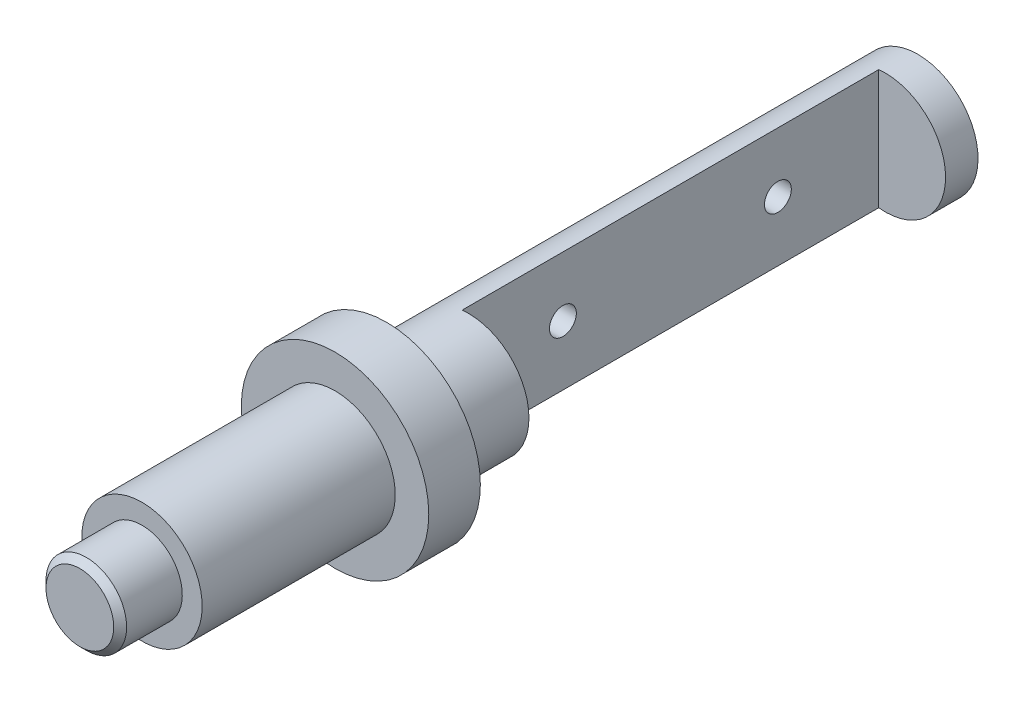
ISO-10303-21;
HEADER;
FILE_DESCRIPTION(('STEP AP214'),'2;1');
FILE_NAME('part.step','',(''),(''),'','','');
FILE_SCHEMA(('AUTOMOTIVE_DESIGN { 1 0 10303 214 1 1 1 1 }'));
ENDSEC;
DATA;
#1=APPLICATION_CONTEXT('core data for automotive mechanical design processes');
#2=APPLICATION_PROTOCOL_DEFINITION('international standard','automotive_design',2000,#1);
#3=PRODUCT_CONTEXT('',#1,'mechanical');
#4=PRODUCT('Part','Part','',(#3));
#5=PRODUCT_RELATED_PRODUCT_CATEGORY('part','',(#4));
#6=PRODUCT_DEFINITION_FORMATION('','',#4);
#7=PRODUCT_DEFINITION_CONTEXT('part definition',#1,'design');
#8=PRODUCT_DEFINITION('design','',#6,#7);
#9=PRODUCT_DEFINITION_SHAPE('','',#8);
#10=(LENGTH_UNIT() NAMED_UNIT(*) SI_UNIT(.MILLI.,.METRE.));
#11=(NAMED_UNIT(*) PLANE_ANGLE_UNIT() SI_UNIT($,.RADIAN.));
#12=(NAMED_UNIT(*) SI_UNIT($,.STERADIAN.) SOLID_ANGLE_UNIT());
#13=UNCERTAINTY_MEASURE_WITH_UNIT(LENGTH_MEASURE(1.E-05),#10,'distance_accuracy_value','');
#14=(GEOMETRIC_REPRESENTATION_CONTEXT(3) GLOBAL_UNCERTAINTY_ASSIGNED_CONTEXT((#13)) GLOBAL_UNIT_ASSIGNED_CONTEXT((#10,
#11,#12)) REPRESENTATION_CONTEXT('',''));
#15=CARTESIAN_POINT('',(0.,0.,0.));
#16=DIRECTION('',(0.,0.,1.));
#17=DIRECTION('',(1.,0.,0.));
#18=AXIS2_PLACEMENT_3D('',#15,#16,#17);
#19=CARTESIAN_POINT('',(0.,0.,0.));
#20=DIRECTION('',(0.,0.,1.));
#21=DIRECTION('',(0.,-1.,0.));
#22=AXIS2_PLACEMENT_3D('',#19,#20,#21);
#23=PLANE('',#22);
#24=CARTESIAN_POINT('',(0.,0.,0.));
#25=DIRECTION('',(0.,0.,1.));
#26=DIRECTION('',(0.,-1.,0.));
#27=AXIS2_PLACEMENT_3D('',#24,#25,#26);
#28=CIRCLE('',#27,15.75);
#29=CARTESIAN_POINT('',(0.,-15.75,0.));
#30=VERTEX_POINT('',#29);
#31=EDGE_CURVE('E11',#30,#30,#28,.T.);
#32=ORIENTED_EDGE('',*,*,#31,.T.);
#33=EDGE_LOOP('',(#32));
#34=FACE_BOUND('',#33,.T.);
#35=ADVANCED_FACE('F33',(#34),#23,.T.);
#36=CARTESIAN_POINT('',(0.,1.28369537222284E-13,-389.8));
#37=DIRECTION('',(0.,0.,-1.));
#38=DIRECTION('',(0.,1.,0.));
#39=AXIS2_PLACEMENT_3D('',#36,#37,#38);
#40=CYLINDRICAL_SURFACE('',#39,18.75);
#41=CARTESIAN_POINT('',(0.,0.,-2.99999999999989));
#42=DIRECTION('',(0.,0.,1.));
#43=DIRECTION('',(0.,-1.,0.));
#44=AXIS2_PLACEMENT_3D('',#41,#42,#43);
#45=CIRCLE('',#44,18.75);
#46=CARTESIAN_POINT('',(0.,-18.75,-2.9999999999999));
#47=VERTEX_POINT('',#46);
#48=EDGE_CURVE('E41',#47,#47,#45,.F.);
#49=ORIENTED_EDGE('',*,*,#48,.T.);
#50=EDGE_LOOP('',(#49));
#51=FACE_BOUND('',#50,.T.);
#52=CARTESIAN_POINT('',(0.,0.,-28.9));
#53=DIRECTION('',(0.,0.,-1.));
#54=DIRECTION('',(0.,1.,0.));
#55=AXIS2_PLACEMENT_3D('',#52,#53,#54);
#56=CIRCLE('',#55,18.75);
#57=CARTESIAN_POINT('',(0.,18.75,-28.9));
#58=VERTEX_POINT('',#57);
#59=EDGE_CURVE('E69',#58,#58,#56,.T.);
#60=ORIENTED_EDGE('',*,*,#59,.F.);
#61=EDGE_LOOP('',(#60));
#62=FACE_BOUND('',#61,.T.);
#63=ADVANCED_FACE('F107',(#51,#62),#40,.T.);
#64=CARTESIAN_POINT('',(0.,18.75,-28.9));
#65=DIRECTION('',(0.,0.,1.));
#66=DIRECTION('',(0.,-1.,0.));
#67=AXIS2_PLACEMENT_3D('',#64,#65,#66);
#68=PLANE('',#67);
#69=ORIENTED_EDGE('',*,*,#59,.T.);
#70=EDGE_LOOP('',(#69));
#71=FACE_BOUND('',#70,.T.);
#72=CARTESIAN_POINT('',(0.,0.,-28.9));
#73=DIRECTION('',(0.,0.,-1.));
#74=DIRECTION('',(0.,1.,0.));
#75=AXIS2_PLACEMENT_3D('',#72,#73,#74);
#76=CIRCLE('',#75,28.);
#77=CARTESIAN_POINT('',(0.,28.,-28.9));
#78=VERTEX_POINT('',#77);
#79=EDGE_CURVE('E98',#78,#78,#76,.T.);
#80=ORIENTED_EDGE('',*,*,#79,.F.);
#81=EDGE_LOOP('',(#80));
#82=FACE_BOUND('',#81,.T.);
#83=ADVANCED_FACE('F125',(#71,#82),#68,.T.);
#84=CARTESIAN_POINT('',(0.,1.28369537222284E-13,-389.8));
#85=DIRECTION('',(0.,0.,-1.));
#86=DIRECTION('',(0.,1.,0.));
#87=AXIS2_PLACEMENT_3D('',#84,#85,#86);
#88=CYLINDRICAL_SURFACE('',#87,28.);
#89=ORIENTED_EDGE('',*,*,#79,.T.);
#90=EDGE_LOOP('',(#89));
#91=FACE_BOUND('',#90,.T.);
#92=CARTESIAN_POINT('',(0.,0.,-118.7));
#93=DIRECTION('',(0.,0.,-1.));
#94=DIRECTION('',(0.,1.,0.));
#95=AXIS2_PLACEMENT_3D('',#92,#93,#94);
#96=CIRCLE('',#95,27.9999999999999);
#97=CARTESIAN_POINT('',(0.,28.,-118.7));
#98=VERTEX_POINT('',#97);
#99=EDGE_CURVE('E95',#98,#98,#96,.T.);
#100=ORIENTED_EDGE('',*,*,#99,.F.);
#101=EDGE_LOOP('',(#100));
#102=FACE_BOUND('',#101,.T.);
#103=ADVANCED_FACE('F130',(#91,#102),#88,.T.);
#104=CARTESIAN_POINT('',(0.,28.,-118.7));
#105=DIRECTION('',(0.,0.,1.));
#106=DIRECTION('',(0.,-1.,0.));
#107=AXIS2_PLACEMENT_3D('',#104,#105,#106);
#108=PLANE('',#107);
#109=ORIENTED_EDGE('',*,*,#99,.T.);
#110=EDGE_LOOP('',(#109));
#111=FACE_BOUND('',#110,.T.);
#112=CARTESIAN_POINT('',(0.,0.,-118.7));
#113=DIRECTION('',(0.,0.,-1.));
#114=DIRECTION('',(0.,1.,0.));
#115=AXIS2_PLACEMENT_3D('',#112,#113,#114);
#116=CIRCLE('',#115,43.6);
#117=CARTESIAN_POINT('',(0.,43.6,-118.7));
#118=VERTEX_POINT('',#117);
#119=EDGE_CURVE('E92',#118,#118,#116,.T.);
#120=ORIENTED_EDGE('',*,*,#119,.F.);
#121=EDGE_LOOP('',(#120));
#122=FACE_BOUND('',#121,.T.);
#123=ADVANCED_FACE('F134',(#111,#122),#108,.T.);
#124=CARTESIAN_POINT('',(0.,1.28369537222284E-13,-389.8));
#125=DIRECTION('',(0.,0.,-1.));
#126=DIRECTION('',(0.,1.,0.));
#127=AXIS2_PLACEMENT_3D('',#124,#125,#126);
#128=CYLINDRICAL_SURFACE('',#127,43.5999999999999);
#129=ORIENTED_EDGE('',*,*,#119,.T.);
#130=EDGE_LOOP('',(#129));
#131=FACE_BOUND('',#130,.T.);
#132=CARTESIAN_POINT('',(0.,0.,-142.7));
#133=DIRECTION('',(0.,0.,-1.));
#134=DIRECTION('',(0.,1.,0.));
#135=AXIS2_PLACEMENT_3D('',#132,#133,#134);
#136=CIRCLE('',#135,43.5999999999999);
#137=CARTESIAN_POINT('',(0.,43.6,-142.7));
#138=VERTEX_POINT('',#137);
#139=EDGE_CURVE('E89',#138,#138,#136,.T.);
#140=ORIENTED_EDGE('',*,*,#139,.F.);
#141=EDGE_LOOP('',(#140));
#142=FACE_BOUND('',#141,.T.);
#143=ADVANCED_FACE('F138',(#131,#142),#128,.T.);
#144=CARTESIAN_POINT('',(0.,43.6,-142.7));
#145=DIRECTION('',(0.,0.,-1.));
#146=DIRECTION('',(0.,1.,0.));
#147=AXIS2_PLACEMENT_3D('',#144,#145,#146);
#148=PLANE('',#147);
#149=ORIENTED_EDGE('',*,*,#139,.T.);
#150=EDGE_LOOP('',(#149));
#151=FACE_BOUND('',#150,.T.);
#152=CARTESIAN_POINT('',(0.,0.,-142.7));
#153=DIRECTION('',(0.,0.,-1.));
#154=DIRECTION('',(0.,1.,0.));
#155=AXIS2_PLACEMENT_3D('',#152,#153,#154);
#156=CIRCLE('',#155,27.9999999999999);
#157=CARTESIAN_POINT('',(0.,28.,-142.7));
#158=VERTEX_POINT('',#157);
#159=EDGE_CURVE('E86',#158,#158,#156,.T.);
#160=ORIENTED_EDGE('',*,*,#159,.F.);
#161=EDGE_LOOP('',(#160));
#162=FACE_BOUND('',#161,.T.);
#163=ADVANCED_FACE('F142',(#151,#162),#148,.T.);
#164=CARTESIAN_POINT('',(0.,1.28369537222284E-13,-389.8));
#165=DIRECTION('',(0.,0.,-1.));
#166=DIRECTION('',(0.,1.,0.));
#167=AXIS2_PLACEMENT_3D('',#164,#165,#166);
#168=CYLINDRICAL_SURFACE('',#167,27.9999999999999);
#169=CARTESIAN_POINT('',(-27.9999999999999,0.,-334.05));
#170=CARTESIAN_POINT('',(-28.0000023074907,-0.173287733266384,-334.050004157336));
#171=CARTESIAN_POINT('',(-27.9983887060986,-0.346526436476237,-334.042791597633));
#172=CARTESIAN_POINT('',(-27.991984406193,-0.691798529480794,-334.014009005228));
#173=CARTESIAN_POINT('',(-27.9871932468602,-0.863831740793935,-333.992436890058));
#174=CARTESIAN_POINT('',(-27.9745615189511,-1.20546852164449,-333.935093131679));
#175=CARTESIAN_POINT('',(-27.9667196516087,-1.37507102443781,-333.89931544065));
#176=CARTESIAN_POINT('',(-27.9482014313873,-1.71063801646036,-333.813834427051));
#177=CARTESIAN_POINT('',(-27.9375240354982,-1.87660114262708,-333.764125979871));
#178=CARTESIAN_POINT('',(-27.9136475008795,-2.20342803103274,-333.651260683326));
#179=CARTESIAN_POINT('',(-27.9004520535613,-2.36429886090373,-333.588123504869));
#180=CARTESIAN_POINT('',(-27.8718836943518,-2.68016000285861,-333.448809422107));
#181=CARTESIAN_POINT('',(-27.8565099794537,-2.83514811947613,-333.372627706833));
#182=CARTESIAN_POINT('',(-27.8240112460598,-3.13808852917944,-333.207829658132));
#183=CARTESIAN_POINT('',(-27.8068869463898,-3.28604367387647,-333.119218423001));
#184=CARTESIAN_POINT('',(-27.7713351594847,-3.57407495168335,-332.930124735688));
#185=CARTESIAN_POINT('',(-27.7529071853002,-3.71414810525705,-332.829637838203));
#186=CARTESIAN_POINT('',(-27.7149723161639,-3.9874327510885,-332.61595298229));
#187=CARTESIAN_POINT('',(-27.6954536070884,-4.12051440767512,-332.502591043081));
#188=CARTESIAN_POINT('',(-27.6561192154838,-4.37674315428556,-332.265102992518));
#189=CARTESIAN_POINT('',(-27.6363034255241,-4.49988654240011,-332.14097290553));
#190=CARTESIAN_POINT('',(-27.5969361383666,-4.73533123112092,-331.882847645637));
#191=CARTESIAN_POINT('',(-27.5773845702218,-4.84763549399912,-331.74885518581));
#192=CARTESIAN_POINT('',(-27.5390789960354,-5.06071673810812,-331.471811192484));
#193=CARTESIAN_POINT('',(-27.5203252869021,-5.1614894512584,-331.328756335032));
#194=CARTESIAN_POINT('',(-27.4839505199678,-5.35181850822238,-331.032926851554));
#195=CARTESIAN_POINT('',(-27.4663445285224,-5.4412363431286,-330.880061190684));
#196=CARTESIAN_POINT('',(-27.4330090939023,-5.60688439498469,-330.567077268975));
#197=CARTESIAN_POINT('',(-27.4172803579063,-5.68310964700896,-330.40695630614));
#198=CARTESIAN_POINT('',(-27.3881854150533,-5.82171201999015,-330.080689184572));
#199=CARTESIAN_POINT('',(-27.3748181028621,-5.88409562345868,-329.914545888894));
#200=CARTESIAN_POINT('',(-27.3508351245555,-5.99457765259043,-329.577384385191));
#201=CARTESIAN_POINT('',(-27.3402204514301,-6.04267092405304,-329.406364442583));
#202=CARTESIAN_POINT('',(-27.3133419530625,-6.16348147602571,-328.893430160608));
#203=CARTESIAN_POINT('',(-27.3015182415444,-6.2151435701817,-328.545934773249));
#204=CARTESIAN_POINT('',(-27.2938833534439,-6.24850925497446,-328.022324811775));
#205=CARTESIAN_POINT('',(-27.2930234997309,-6.2522693123614,-327.847323914374));
#206=CARTESIAN_POINT('',(-27.2946587718571,-6.2451281854667,-327.49761573857));
#207=CARTESIAN_POINT('',(-27.2971539413054,-6.23422681061352,-327.322908464015));
#208=CARTESIAN_POINT('',(-27.3094493243996,-6.18026048197205,-326.807898746191));
#209=CARTESIAN_POINT('',(-27.3239631647026,-6.11636371447944,-326.469657624295));
#210=CARTESIAN_POINT('',(-27.3640732042139,-5.93430755690991,-325.808998983288));
#211=CARTESIAN_POINT('',(-27.3896700482405,-5.81614500958077,-325.486582386076));
#212=CARTESIAN_POINT('',(-27.4492987065179,-5.52790655715218,-324.863417511138));
#213=CARTESIAN_POINT('',(-27.483398426653,-5.35741003786134,-324.562870142178));
#214=CARTESIAN_POINT('',(-27.5561513937306,-4.96963966609142,-323.994257969914));
#215=CARTESIAN_POINT('',(-27.5948052853185,-4.75235918770834,-323.726197776107));
#216=CARTESIAN_POINT('',(-27.6733802530294,-4.27137013352201,-323.223809853688));
#217=CARTESIAN_POINT('',(-27.7133102487925,-4.00672510942754,-322.990379079378));
#218=CARTESIAN_POINT('',(-27.7891457801461,-3.44158844330935,-322.571063991448));
#219=CARTESIAN_POINT('',(-27.8250512368439,-3.14109609881231,-322.385180609802));
#220=CARTESIAN_POINT('',(-27.888916327394,-2.51167474315627,-322.065999616849));
#221=CARTESIAN_POINT('',(-27.9168575843371,-2.18268221225621,-321.932823353538));
#222=CARTESIAN_POINT('',(-27.9615100011375,-1.50622494940627,-321.72389552417));
#223=CARTESIAN_POINT('',(-27.9782228632755,-1.15876302613159,-321.648135253341));
#224=CARTESIAN_POINT('',(-27.9982917913806,-0.462921185445332,-321.557503392358));
#225=CARTESIAN_POINT('',(-28.0019164988761,-0.114708330446514,-321.541406982883));
#226=CARTESIAN_POINT('',(-27.9961551885655,0.579431141153249,-321.567234695801));
#227=CARTESIAN_POINT('',(-27.9867700918,0.925357917857113,-321.609154710869));
#228=CARTESIAN_POINT('',(-27.9562136095176,1.60102042690681,-321.748810016843));
#229=CARTESIAN_POINT('',(-27.9351786925778,1.93089639113396,-321.845899377985));
#230=CARTESIAN_POINT('',(-27.883678539535,2.56967883178063,-322.092418810743));
#231=CARTESIAN_POINT('',(-27.8532124775042,2.87858346875663,-322.241853466623));
#232=CARTESIAN_POINT('',(-27.7855691492714,3.47169220712508,-322.591344560413));
#233=CARTESIAN_POINT('',(-27.7482994216927,3.75546419123478,-322.792115948466));
#234=CARTESIAN_POINT('',(-27.6713646917784,4.28573159126942,-323.23766094087));
#235=CARTESIAN_POINT('',(-27.6316993650308,4.53222194260744,-323.482440513721));
#236=CARTESIAN_POINT('',(-27.5535125980945,4.98578225781705,-324.014619112825));
#237=CARTESIAN_POINT('',(-27.5150278704221,5.1920021450379,-324.302747785556));
#238=CARTESIAN_POINT('',(-27.4444213582734,5.55318005696324,-324.910464331259));
#239=CARTESIAN_POINT('',(-27.412299295071,5.70814032737225,-325.230050825253));
#240=CARTESIAN_POINT('',(-27.3718192690612,5.8980993093084,-325.724892101699));
#241=CARTESIAN_POINT('',(-27.3596295447549,5.95425582185381,-325.892003452291));
#242=CARTESIAN_POINT('',(-27.3381107961361,6.05229245748582,-326.230526424614));
#243=CARTESIAN_POINT('',(-27.3287807074909,6.09417789279903,-326.401936420665));
#244=CARTESIAN_POINT('',(-27.3132698536944,6.16332227927619,-326.747820829415));
#245=CARTESIAN_POINT('',(-27.3070892654711,6.19058040873379,-326.922295413702));
#246=CARTESIAN_POINT('',(-27.2980677291032,6.23024201169865,-327.273008747091));
#247=CARTESIAN_POINT('',(-27.2952266431117,6.24264609834678,-327.449247423074));
#248=CARTESIAN_POINT('',(-27.2929984334103,6.25238023667572,-327.798143905916));
#249=CARTESIAN_POINT('',(-27.2935341846288,6.25004688074713,-327.970791939161));
#250=CARTESIAN_POINT('',(-27.2978631892481,6.23111223119597,-328.315259970258));
#251=CARTESIAN_POINT('',(-27.3016563761431,6.2145112288704,-328.487079984945));
#252=CARTESIAN_POINT('',(-27.3123881868279,6.16717429747138,-328.82868909271));
#253=CARTESIAN_POINT('',(-27.3193273222637,6.13643606915781,-328.998477850821));
#254=CARTESIAN_POINT('',(-27.336143147294,6.06108612830196,-329.334734955742));
#255=CARTESIAN_POINT('',(-27.3460187951259,6.01647933554218,-329.501204457786));
#256=CARTESIAN_POINT('',(-27.3683819096736,5.91391695166168,-329.829163456557));
#257=CARTESIAN_POINT('',(-27.3808602567915,5.85600790038149,-329.990668140427));
#258=CARTESIAN_POINT('',(-27.4080885496008,5.72721655121537,-330.308152063312));
#259=CARTESIAN_POINT('',(-27.4228376985691,5.65633880183057,-330.464133216768));
#260=CARTESIAN_POINT('',(-27.4542043948437,5.50207735834756,-330.769670897887));
#261=CARTESIAN_POINT('',(-27.470822747199,5.41868827052604,-330.919224618692));
#262=CARTESIAN_POINT('',(-27.5054585978041,5.24004005325539,-331.210822128643));
#263=CARTESIAN_POINT('',(-27.5234756244718,5.14478491811205,-331.352868422104));
#264=CARTESIAN_POINT('',(-27.56082083658,4.94086270821174,-331.631556083576));
#265=CARTESIAN_POINT('',(-27.5801688265782,4.83195229564786,-331.768016801897));
#266=CARTESIAN_POINT('',(-27.6192728309797,4.60317572148802,-332.0312733688));
#267=CARTESIAN_POINT('',(-27.6390287017366,4.48331336764059,-332.158072548577));
#268=CARTESIAN_POINT('',(-27.6784207302392,4.23332522432961,-332.401291919222));
#269=CARTESIAN_POINT('',(-27.6980568104058,4.10319341611145,-332.517705937093));
#270=CARTESIAN_POINT('',(-27.736649854323,3.83363825662295,-332.739245082892));
#271=CARTESIAN_POINT('',(-27.7556070643537,3.69421832848536,-332.844374332922));
#272=CARTESIAN_POINT('',(-27.792587343873,3.40494373096441,-333.044061116773));
#273=CARTESIAN_POINT('',(-27.8105935516114,3.25496999808167,-333.138449412463));
#274=CARTESIAN_POINT('',(-27.8448634637058,2.94745730260299,-333.314195222934));
#275=CARTESIAN_POINT('',(-27.8611278091304,2.78992115437886,-333.395557537243));
#276=CARTESIAN_POINT('',(-27.8914504457953,2.46840729727076,-333.544635667202));
#277=CARTESIAN_POINT('',(-27.9055099063001,2.3044330606293,-333.612358721292));
#278=CARTESIAN_POINT('',(-27.9310283273155,1.97119532300798,-333.733661963131));
#279=CARTESIAN_POINT('',(-27.9424877419763,1.80193275162732,-333.787244621052));
#280=CARTESIAN_POINT('',(-27.967941766288,1.36548835922047,-333.905183303216));
#281=CARTESIAN_POINT('',(-27.9798958519048,1.0953766455279,-333.959407046202));
#282=CARTESIAN_POINT('',(-27.9959229491086,0.550135299286098,-334.031811232906));
#283=CARTESIAN_POINT('',(-27.999996338035,0.275005907627422,-334.049993402349));
#284=CARTESIAN_POINT('',(-27.9999999999999,0.,-334.05));
#285=B_SPLINE_CURVE_WITH_KNOTS('',3,(#169,#170,#171,#172,#173,#174,#175,#176,#177,#178,#179,
#180,#181,#182,#183,#184,#185,#186,#187,#188,#189,#190,#191,#192,#193,#194,#195,#196,#197,#198,
#199,#200,#201,#202,#203,#204,#205,#206,#207,#208,#209,#210,#211,#212,#213,#214,#215,#216,#217,
#218,#219,#220,#221,#222,#223,#224,#225,#226,#227,#228,#229,#230,#231,#232,#233,#234,#235,#236,
#237,#238,#239,#240,#241,#242,#243,#244,#245,#246,#247,#248,#249,#250,#251,#252,#253,#254,#255,
#256,#257,#258,#259,#260,#261,#262,#263,#264,#265,#266,#267,#268,#269,#270,#271,#272,#273,#274,
#275,#276,#277,#278,#279,#280,#281,#282,#283,#284),.UNSPECIFIED.,.T.,.F.,(4,2,2,2,2,2,2,2,2,2,2,
2,2,2,2,2,2,2,2,2,2,2,2,2,2,2,2,2,2,2,2,2,2,2,2,2,2,2,2,2,2,2,2,2,2,2,2,2,2,2,2,2,2,2,2,2,2,4),
(0.,0.519621355439259,1.03931808443778,1.55923630446093,2.07934603473738,2.59869907232142,
3.11824406723571,3.6375765768215,4.15710410262733,4.6842071182354,5.21150557703533,
5.73865951763688,6.26600794272355,6.79927224394424,7.33273680068073,7.86595098810624,
8.3993572610737,9.44774844022995,9.97235964957361,10.4969776779594,11.5252983768463,
12.5536789123229,13.5905512322957,14.6275704988054,15.6879740503837,16.7483983853177,
17.8112501352816,18.8739407152331,19.9146908936509,20.9553673950021,21.9841034233241,
23.0129295681878,24.0569484922651,25.1011091157345,26.1653675706145,27.2295793937244,
27.7591901244011,28.2886034983027,28.818046609519,29.3474678657824,29.8648419429659,
30.3822054573744,30.8996531441532,31.41691747879,31.9323989349574,32.4476999420771,
32.9632237407066,33.4785744721473,34.0049506918992,34.5311445936064,35.0576492123303,
35.5839608501372,36.1176653274807,36.6511727022891,37.184396190977,37.7175264696495,
38.5421998754906,39.3668337937813),.UNSPECIFIED.);
#286=CARTESIAN_POINT('',(-27.9999999999999,0.,-334.05));
#287=VERTEX_POINT('',#286);
#288=EDGE_CURVE('E159',#287,#287,#285,.T.);
#289=ORIENTED_EDGE('',*,*,#288,.F.);
#290=EDGE_LOOP('',(#289));
#291=FACE_BOUND('',#290,.T.);
#292=CARTESIAN_POINT('',(-27.9999999999999,0.,-234.05));
#293=CARTESIAN_POINT('',(-28.0000023074907,-0.173287733266385,-234.050004157336));
#294=CARTESIAN_POINT('',(-27.9983887060986,-0.346526436476238,-234.042791597633));
#295=CARTESIAN_POINT('',(-27.991984406193,-0.691798529480794,-234.014009005228));
#296=CARTESIAN_POINT('',(-27.9871932468602,-0.863831740793932,-233.992436890058));
#297=CARTESIAN_POINT('',(-27.9745615189511,-1.20546852164449,-233.935093131679));
#298=CARTESIAN_POINT('',(-27.9667196516088,-1.37507102443781,-233.89931544065));
#299=CARTESIAN_POINT('',(-27.9482014313873,-1.71063801646037,-233.813834427051));
#300=CARTESIAN_POINT('',(-27.9375240354982,-1.87660114262709,-233.764125979871));
#301=CARTESIAN_POINT('',(-27.9136475008795,-2.20342803103274,-233.651260683326));
#302=CARTESIAN_POINT('',(-27.9004520535613,-2.36429886090373,-233.588123504869));
#303=CARTESIAN_POINT('',(-27.8718836943518,-2.6801600028586,-233.448809422107));
#304=CARTESIAN_POINT('',(-27.8565099794537,-2.83514811947612,-233.372627706833));
#305=CARTESIAN_POINT('',(-27.8240112460598,-3.13808852917943,-233.207829658132));
#306=CARTESIAN_POINT('',(-27.8068869463898,-3.28604367387645,-233.119218423001));
#307=CARTESIAN_POINT('',(-27.7713351594847,-3.57407495168333,-232.930124735688));
#308=CARTESIAN_POINT('',(-27.7529071853002,-3.71414810525704,-232.829637838203));
#309=CARTESIAN_POINT('',(-27.7149723161639,-3.9874327510885,-232.61595298229));
#310=CARTESIAN_POINT('',(-27.6954536070884,-4.12051440767511,-232.502591043081));
#311=CARTESIAN_POINT('',(-27.6561192154838,-4.37674315428556,-232.265102992518));
#312=CARTESIAN_POINT('',(-27.6363034255242,-4.49988654240013,-232.14097290553));
#313=CARTESIAN_POINT('',(-27.5969361383666,-4.73533123112094,-231.882847645637));
#314=CARTESIAN_POINT('',(-27.5773845702218,-4.84763549399913,-231.74885518581));
#315=CARTESIAN_POINT('',(-27.5390789960354,-5.06071673810812,-231.471811192484));
#316=CARTESIAN_POINT('',(-27.5203252869021,-5.1614894512584,-231.328756335032));
#317=CARTESIAN_POINT('',(-27.4839505199678,-5.35181850822239,-231.032926851554));
#318=CARTESIAN_POINT('',(-27.4663445285224,-5.44123634312861,-230.880061190684));
#319=CARTESIAN_POINT('',(-27.4330090939023,-5.60688439498472,-230.567077268975));
#320=CARTESIAN_POINT('',(-27.4172803579063,-5.68310964700899,-230.40695630614));
#321=CARTESIAN_POINT('',(-27.3881854150533,-5.82171201999018,-230.080689184571));
#322=CARTESIAN_POINT('',(-27.3748181028621,-5.8840956234587,-229.914545888894));
#323=CARTESIAN_POINT('',(-27.3508351245555,-5.99457765259043,-229.577384385191));
#324=CARTESIAN_POINT('',(-27.3402204514301,-6.04267092405305,-229.406364442583));
#325=CARTESIAN_POINT('',(-27.3133419530625,-6.16348147602571,-228.893430160608));
#326=CARTESIAN_POINT('',(-27.3015182415444,-6.2151435701817,-228.545934773249));
#327=CARTESIAN_POINT('',(-27.2938833534439,-6.24850925497446,-228.022324811775));
#328=CARTESIAN_POINT('',(-27.2930234997309,-6.2522693123614,-227.847323914374));
#329=CARTESIAN_POINT('',(-27.2946587718571,-6.2451281854667,-227.49761573857));
#330=CARTESIAN_POINT('',(-27.2971539413054,-6.23422681061353,-227.322908464015));
#331=CARTESIAN_POINT('',(-27.3094493243996,-6.18026048197206,-226.807898746191));
#332=CARTESIAN_POINT('',(-27.3239631647026,-6.11636371447946,-226.469657624295));
#333=CARTESIAN_POINT('',(-27.3640732042139,-5.93430755690992,-225.808998983288));
#334=CARTESIAN_POINT('',(-27.3896700482405,-5.81614500958078,-225.486582386076));
#335=CARTESIAN_POINT('',(-27.4492987065179,-5.5279065571522,-224.863417511138));
#336=CARTESIAN_POINT('',(-27.483398426653,-5.35741003786136,-224.562870142178));
#337=CARTESIAN_POINT('',(-27.5561513937306,-4.96963966609144,-223.994257969914));
#338=CARTESIAN_POINT('',(-27.5948052853185,-4.75235918770835,-223.726197776107));
#339=CARTESIAN_POINT('',(-27.6733802530294,-4.27137013352202,-223.223809853688));
#340=CARTESIAN_POINT('',(-27.7133102487925,-4.00672510942755,-222.990379079378));
#341=CARTESIAN_POINT('',(-27.7891457801461,-3.44158844330937,-222.571063991448));
#342=CARTESIAN_POINT('',(-27.8250512368439,-3.14109609881234,-222.385180609802));
#343=CARTESIAN_POINT('',(-27.8889163273941,-2.51167474315629,-222.065999616849));
#344=CARTESIAN_POINT('',(-27.9168575843372,-2.18268221225622,-221.932823353538));
#345=CARTESIAN_POINT('',(-27.9615100011376,-1.50622494940626,-221.723895524171));
#346=CARTESIAN_POINT('',(-27.9782228632755,-1.15876302613157,-221.648135253341));
#347=CARTESIAN_POINT('',(-27.9982917913806,-0.462921185445308,-221.557503392358));
#348=CARTESIAN_POINT('',(-28.0019164988761,-0.114708330446492,-221.541406982883));
#349=CARTESIAN_POINT('',(-27.9961551885655,0.579431141153261,-221.567234695801));
#350=CARTESIAN_POINT('',(-27.9867700918,0.925357917857119,-221.609154710869));
#351=CARTESIAN_POINT('',(-27.9562136095176,1.60102042690682,-221.748810016843));
#352=CARTESIAN_POINT('',(-27.9351786925778,1.93089639113398,-221.845899377985));
#353=CARTESIAN_POINT('',(-27.883678539535,2.56967883178064,-222.092418810743));
#354=CARTESIAN_POINT('',(-27.8532124775042,2.87858346875663,-222.241853466623));
#355=CARTESIAN_POINT('',(-27.7855691492714,3.47169220712507,-222.591344560413));
#356=CARTESIAN_POINT('',(-27.7482994216926,3.75546419123479,-222.792115948466));
#357=CARTESIAN_POINT('',(-27.6713646917784,4.28573159126944,-223.23766094087));
#358=CARTESIAN_POINT('',(-27.6316993650308,4.53222194260745,-223.482440513721));
#359=CARTESIAN_POINT('',(-27.5535125980945,4.98578225781707,-224.014619112825));
#360=CARTESIAN_POINT('',(-27.5150278704221,5.19200214503791,-224.302747785557));
#361=CARTESIAN_POINT('',(-27.4444213582734,5.55318005696324,-224.910464331259));
#362=CARTESIAN_POINT('',(-27.412299295071,5.70814032737226,-225.230050825253));
#363=CARTESIAN_POINT('',(-27.3718192690612,5.89809930930841,-225.7248921017));
#364=CARTESIAN_POINT('',(-27.3596295447549,5.95425582185382,-225.892003452291));
#365=CARTESIAN_POINT('',(-27.3381107961361,6.05229245748583,-226.230526424614));
#366=CARTESIAN_POINT('',(-27.3287807074909,6.09417789279904,-226.401936420665));
#367=CARTESIAN_POINT('',(-27.3132698536944,6.1633222792762,-226.747820829415));
#368=CARTESIAN_POINT('',(-27.3070892654711,6.1905804087338,-226.922295413702));
#369=CARTESIAN_POINT('',(-27.2980677291032,6.23024201169865,-227.273008747091));
#370=CARTESIAN_POINT('',(-27.2952266431116,6.24264609834679,-227.449247423074));
#371=CARTESIAN_POINT('',(-27.2929984334103,6.25238023667573,-227.798143905916));
#372=CARTESIAN_POINT('',(-27.2935341846288,6.25004688074713,-227.970791939161));
#373=CARTESIAN_POINT('',(-27.2978631892481,6.23111223119597,-228.315259970258));
#374=CARTESIAN_POINT('',(-27.3016563761431,6.21451122887041,-228.487079984945));
#375=CARTESIAN_POINT('',(-27.3123881868279,6.16717429747139,-228.82868909271));
#376=CARTESIAN_POINT('',(-27.3193273222637,6.13643606915782,-228.998477850821));
#377=CARTESIAN_POINT('',(-27.336143147294,6.06108612830197,-229.334734955742));
#378=CARTESIAN_POINT('',(-27.3460187951259,6.0164793355422,-229.501204457786));
#379=CARTESIAN_POINT('',(-27.3683819096736,5.9139169516617,-229.829163456557));
#380=CARTESIAN_POINT('',(-27.3808602567915,5.85600790038152,-229.990668140427));
#381=CARTESIAN_POINT('',(-27.4080885496008,5.7272165512154,-230.308152063312));
#382=CARTESIAN_POINT('',(-27.4228376985691,5.65633880183059,-230.464133216768));
#383=CARTESIAN_POINT('',(-27.4542043948437,5.50207735834757,-230.769670897887));
#384=CARTESIAN_POINT('',(-27.470822747199,5.41868827052607,-230.919224618692));
#385=CARTESIAN_POINT('',(-27.5054585978041,5.24004005325543,-231.210822128643));
#386=CARTESIAN_POINT('',(-27.5234756244718,5.14478491811208,-231.352868422104));
#387=CARTESIAN_POINT('',(-27.5608208365799,4.94086270821176,-231.631556083576));
#388=CARTESIAN_POINT('',(-27.5801688265782,4.83195229564788,-231.768016801897));
#389=CARTESIAN_POINT('',(-27.6192728309797,4.60317572148806,-232.0312733688));
#390=CARTESIAN_POINT('',(-27.6390287017366,4.48331336764063,-232.158072548577));
#391=CARTESIAN_POINT('',(-27.6784207302392,4.23332522432966,-232.401291919222));
#392=CARTESIAN_POINT('',(-27.6980568104057,4.10319341611151,-232.517705937093));
#393=CARTESIAN_POINT('',(-27.736649854323,3.83363825662299,-232.739245082892));
#394=CARTESIAN_POINT('',(-27.7556070643537,3.69421832848539,-232.844374332922));
#395=CARTESIAN_POINT('',(-27.792587343873,3.40494373096441,-233.044061116773));
#396=CARTESIAN_POINT('',(-27.8105935516114,3.25496999808166,-233.138449412463));
#397=CARTESIAN_POINT('',(-27.8448634637058,2.94745730260298,-233.314195222934));
#398=CARTESIAN_POINT('',(-27.8611278091304,2.78992115437887,-233.395557537243));
#399=CARTESIAN_POINT('',(-27.8914504457953,2.46840729727077,-233.544635667202));
#400=CARTESIAN_POINT('',(-27.9055099063001,2.30443306062931,-233.612358721292));
#401=CARTESIAN_POINT('',(-27.9310283273155,1.97119532300799,-233.733661963131));
#402=CARTESIAN_POINT('',(-27.9424877419763,1.80193275162733,-233.787244621052));
#403=CARTESIAN_POINT('',(-27.967941766288,1.36548835922047,-233.905183303216));
#404=CARTESIAN_POINT('',(-27.9798958519048,1.0953766455279,-233.959407046202));
#405=CARTESIAN_POINT('',(-27.9959229491086,0.550135299286096,-234.031811232906));
#406=CARTESIAN_POINT('',(-27.999996338035,0.27500590762742,-234.049993402349));
#407=CARTESIAN_POINT('',(-27.9999999999999,0.,-234.05));
#408=B_SPLINE_CURVE_WITH_KNOTS('',3,(#292,#293,#294,#295,#296,#297,#298,#299,#300,#301,#302,
#303,#304,#305,#306,#307,#308,#309,#310,#311,#312,#313,#314,#315,#316,#317,#318,#319,#320,#321,
#322,#323,#324,#325,#326,#327,#328,#329,#330,#331,#332,#333,#334,#335,#336,#337,#338,#339,#340,
#341,#342,#343,#344,#345,#346,#347,#348,#349,#350,#351,#352,#353,#354,#355,#356,#357,#358,#359,
#360,#361,#362,#363,#364,#365,#366,#367,#368,#369,#370,#371,#372,#373,#374,#375,#376,#377,#378,
#379,#380,#381,#382,#383,#384,#385,#386,#387,#388,#389,#390,#391,#392,#393,#394,#395,#396,#397,
#398,#399,#400,#401,#402,#403,#404,#405,#406,#407),.UNSPECIFIED.,.T.,.F.,(4,2,2,2,2,2,2,2,2,2,2,
2,2,2,2,2,2,2,2,2,2,2,2,2,2,2,2,2,2,2,2,2,2,2,2,2,2,2,2,2,2,2,2,2,2,2,2,2,2,2,2,2,2,2,2,2,2,4),
(0.,0.519621355439262,1.03931808443778,1.55923630446094,2.07934603473738,2.59869907232141,
3.1182440672357,3.63757657682148,4.15710410262729,4.68420711823537,5.21150557703534,
5.73865951763688,6.26600794272354,6.79927224394429,7.33273680068082,7.86595098810629,
8.39935726107373,9.44774844022995,9.97235964957352,10.4969776779593,11.5252983768463,
12.5536789123229,13.5905512322956,14.6275704988054,15.6879740503837,16.7483983853177,
17.8112501352815,18.8739407152331,19.9146908936509,20.9553673950021,21.9841034233242,
23.0129295681878,24.0569484922651,25.1011091157345,26.1653675706146,27.2295793937244,
27.7591901244012,28.2886034983027,28.8180466095191,29.3474678657824,29.8648419429658,
30.3822054573745,30.8996531441531,31.41691747879,31.9323989349573,32.4476999420771,
32.9632237407066,33.4785744721473,34.0049506918991,34.5311445936064,35.0576492123303,
35.5839608501371,36.1176653274807,36.6511727022891,37.184396190977,37.7175264696495,
38.5421998754906,39.3668337937813),.UNSPECIFIED.);
#409=CARTESIAN_POINT('',(-27.9999999999999,0.,-234.05));
#410=VERTEX_POINT('',#409);
#411=EDGE_CURVE('E76',#410,#410,#408,.T.);
#412=ORIENTED_EDGE('',*,*,#411,.F.);
#413=EDGE_LOOP('',(#412));
#414=FACE_BOUND('',#413,.T.);
#415=DIRECTION('',(0.,0.,-1.));
#416=VECTOR('',#415,1.);
#417=CARTESIAN_POINT('',(-3.1000000000001,-27.8278637340344,-389.8));
#418=LINE('',#417,#416);
#419=CARTESIAN_POINT('',(-3.1000000000001,-27.8278637340344,-180.9));
#420=VERTEX_POINT('',#419);
#421=CARTESIAN_POINT('',(-3.1000000000001,-27.8278637340344,-374.7));
#422=VERTEX_POINT('',#421);
#423=EDGE_CURVE('E66',#420,#422,#418,.T.);
#424=ORIENTED_EDGE('',*,*,#423,.F.);
#425=CARTESIAN_POINT('',(0.,0.,-180.9));
#426=DIRECTION('',(0.,0.,1.));
#427=DIRECTION('',(1.,0.,0.));
#428=AXIS2_PLACEMENT_3D('',#425,#426,#427);
#429=CIRCLE('',#428,27.9999999999999);
#430=CARTESIAN_POINT('',(-3.1000000000001,27.8278637340346,-180.9));
#431=VERTEX_POINT('',#430);
#432=EDGE_CURVE('E54',#431,#420,#429,.F.);
#433=ORIENTED_EDGE('',*,*,#432,.F.);
#434=DIRECTION('',(0.,0.,-1.));
#435=VECTOR('',#434,1.);
#436=CARTESIAN_POINT('',(-3.1000000000001,27.8278637340347,-389.8));
#437=LINE('',#436,#435);
#438=CARTESIAN_POINT('',(-3.1000000000001,27.8278637340346,-374.7));
#439=VERTEX_POINT('',#438);
#440=EDGE_CURVE('E48',#439,#431,#437,.F.);
#441=ORIENTED_EDGE('',*,*,#440,.F.);
#442=CARTESIAN_POINT('',(0.,1.23396781932247E-13,-374.7));
#443=DIRECTION('',(0.,0.,-1.));
#444=DIRECTION('',(-1.,0.,0.));
#445=AXIS2_PLACEMENT_3D('',#442,#443,#444);
#446=CIRCLE('',#445,27.9999999999999);
#447=EDGE_CURVE('E62',#422,#439,#446,.F.);
#448=ORIENTED_EDGE('',*,*,#447,.F.);
#449=EDGE_LOOP('',(#424,#433,#441,#448));
#450=FACE_BOUND('',#449,.T.);
#451=ORIENTED_EDGE('',*,*,#159,.T.);
#452=EDGE_LOOP('',(#451));
#453=FACE_BOUND('',#452,.T.);
#454=CARTESIAN_POINT('',(0.,1.28369537222284E-13,-389.8));
#455=DIRECTION('',(0.,0.,-1.));
#456=DIRECTION('',(0.,1.,0.));
#457=AXIS2_PLACEMENT_3D('',#454,#455,#456);
#458=CIRCLE('',#457,27.9999999999999);
#459=CARTESIAN_POINT('',(0.,28.,-389.8));
#460=VERTEX_POINT('',#459);
#461=EDGE_CURVE('E78',#460,#460,#458,.T.);
#462=ORIENTED_EDGE('',*,*,#461,.F.);
#463=EDGE_LOOP('',(#462));
#464=FACE_BOUND('',#463,.T.);
#465=ADVANCED_FACE('F64',(#291,#414,#450,#453,#464),#168,.T.);
#466=CARTESIAN_POINT('',(0.,28.,-389.8));
#467=DIRECTION('',(0.,0.,-1.));
#468=DIRECTION('',(0.,1.,0.));
#469=AXIS2_PLACEMENT_3D('',#466,#467,#468);
#470=PLANE('',#469);
#471=ORIENTED_EDGE('',*,*,#461,.T.);
#472=EDGE_LOOP('',(#471));
#473=FACE_BOUND('',#472,.T.);
#474=ADVANCED_FACE('F150',(#473),#470,.T.);
#475=CARTESIAN_POINT('',(27.9999999999999,-43.5999999999999,-180.9));
#476=DIRECTION('',(0.,0.,1.));
#477=DIRECTION('',(1.,0.,0.));
#478=AXIS2_PLACEMENT_3D('',#475,#476,#477);
#479=PLANE('',#478);
#480=ORIENTED_EDGE('',*,*,#432,.T.);
#481=DIRECTION('',(0.,1.,0.));
#482=VECTOR('',#481,1.);
#483=CARTESIAN_POINT('',(-3.1000000000001,-43.5999999999999,-180.9));
#484=LINE('',#483,#482);
#485=EDGE_CURVE('E73',#420,#431,#484,.T.);
#486=ORIENTED_EDGE('',*,*,#485,.T.);
#487=EDGE_LOOP('',(#480,#486));
#488=FACE_BOUND('',#487,.T.);
#489=ADVANCED_FACE('F170',(#488),#479,.F.);
#490=CARTESIAN_POINT('',(-3.1000000000001,-43.5999999999999,-180.9));
#491=DIRECTION('',(-1.,0.,0.));
#492=DIRECTION('',(0.,0.,1.));
#493=AXIS2_PLACEMENT_3D('',#490,#491,#492);
#494=PLANE('',#493);
#495=CARTESIAN_POINT('',(-3.1000000000001,0.,-327.8));
#496=DIRECTION('',(1.,0.,0.));
#497=DIRECTION('',(0.,0.,-1.));
#498=AXIS2_PLACEMENT_3D('',#495,#496,#497);
#499=CIRCLE('',#498,6.25);
#500=CARTESIAN_POINT('',(-3.1000000000001,0.,-334.05));
#501=VERTEX_POINT('',#500);
#502=EDGE_CURVE('E164',#501,#501,#499,.T.);
#503=ORIENTED_EDGE('',*,*,#502,.F.);
#504=EDGE_LOOP('',(#503));
#505=FACE_BOUND('',#504,.T.);
#506=CARTESIAN_POINT('',(-3.1000000000001,0.,-227.8));
#507=DIRECTION('',(1.,0.,0.));
#508=DIRECTION('',(0.,0.,-1.));
#509=AXIS2_PLACEMENT_3D('',#506,#507,#508);
#510=CIRCLE('',#509,6.25);
#511=CARTESIAN_POINT('',(-3.1000000000001,0.,-234.05));
#512=VERTEX_POINT('',#511);
#513=EDGE_CURVE('E81',#512,#512,#510,.T.);
#514=ORIENTED_EDGE('',*,*,#513,.F.);
#515=EDGE_LOOP('',(#514));
#516=FACE_BOUND('',#515,.T.);
#517=ORIENTED_EDGE('',*,*,#440,.T.);
#518=ORIENTED_EDGE('',*,*,#485,.F.);
#519=ORIENTED_EDGE('',*,*,#423,.T.);
#520=DIRECTION('',(0.,1.,0.));
#521=VECTOR('',#520,1.);
#522=CARTESIAN_POINT('',(-3.1000000000001,-43.5999999999999,-374.7));
#523=LINE('',#522,#521);
#524=EDGE_CURVE('E72',#422,#439,#523,.T.);
#525=ORIENTED_EDGE('',*,*,#524,.T.);
#526=EDGE_LOOP('',(#517,#518,#519,#525));
#527=FACE_BOUND('',#526,.T.);
#528=ADVANCED_FACE('F71',(#505,#516,#527),#494,.F.);
#529=CARTESIAN_POINT('',(27.9999999999999,-43.5999999999999,-374.7));
#530=DIRECTION('',(0.,0.,-1.));
#531=DIRECTION('',(-1.,0.,0.));
#532=AXIS2_PLACEMENT_3D('',#529,#530,#531);
#533=PLANE('',#532);
#534=ORIENTED_EDGE('',*,*,#524,.F.);
#535=ORIENTED_EDGE('',*,*,#447,.T.);
#536=EDGE_LOOP('',(#534,#535));
#537=FACE_BOUND('',#536,.T.);
#538=ADVANCED_FACE('F75',(#537),#533,.F.);
#539=CARTESIAN_POINT('',(-43.6,0.,-227.8));
#540=DIRECTION('',(1.,0.,0.));
#541=DIRECTION('',(0.,0.,-1.));
#542=AXIS2_PLACEMENT_3D('',#539,#540,#541);
#543=CYLINDRICAL_SURFACE('',#542,6.25);
#544=ORIENTED_EDGE('',*,*,#411,.T.);
#545=EDGE_LOOP('',(#544));
#546=FACE_BOUND('',#545,.T.);
#547=ORIENTED_EDGE('',*,*,#513,.T.);
#548=EDGE_LOOP('',(#547));
#549=FACE_BOUND('',#548,.T.);
#550=ADVANCED_FACE('F116',(#546,#549),#543,.F.);
#551=CARTESIAN_POINT('',(-43.6,0.,-327.8));
#552=DIRECTION('',(1.,0.,0.));
#553=DIRECTION('',(0.,0.,-1.));
#554=AXIS2_PLACEMENT_3D('',#551,#552,#553);
#555=CYLINDRICAL_SURFACE('',#554,6.25);
#556=ORIENTED_EDGE('',*,*,#288,.T.);
#557=EDGE_LOOP('',(#556));
#558=FACE_BOUND('',#557,.T.);
#559=ORIENTED_EDGE('',*,*,#502,.T.);
#560=EDGE_LOOP('',(#559));
#561=FACE_BOUND('',#560,.T.);
#562=ADVANCED_FACE('F111',(#558,#561),#555,.F.);
#563=CARTESIAN_POINT('',(0.,0.,-2.99999999999989));
#564=DIRECTION('',(0.,0.,-1.));
#565=DIRECTION('',(0.,1.,0.));
#566=AXIS2_PLACEMENT_3D('',#563,#564,#565);
#567=CONICAL_SURFACE('',#566,18.75,0.785398163397455);
#568=ORIENTED_EDGE('',*,*,#31,.F.);
#569=EDGE_LOOP('',(#568));
#570=FACE_BOUND('',#569,.T.);
#571=ORIENTED_EDGE('',*,*,#48,.F.);
#572=EDGE_LOOP('',(#571));
#573=FACE_BOUND('',#572,.T.);
#574=ADVANCED_FACE('F35',(#570,#573),#567,.T.);
#575=CLOSED_SHELL('',(#35,#63,#83,#103,#123,#143,#163,#465,#474,#489,#528,#538,#550,#562,#574));
#576=MANIFOLD_SOLID_BREP('B2',#575);
#577=ADVANCED_BREP_SHAPE_REPRESENTATION('',(#18,#576),#14);
#578=SHAPE_DEFINITION_REPRESENTATION(#9,#577);
ENDSEC;
END-ISO-10303-21;
